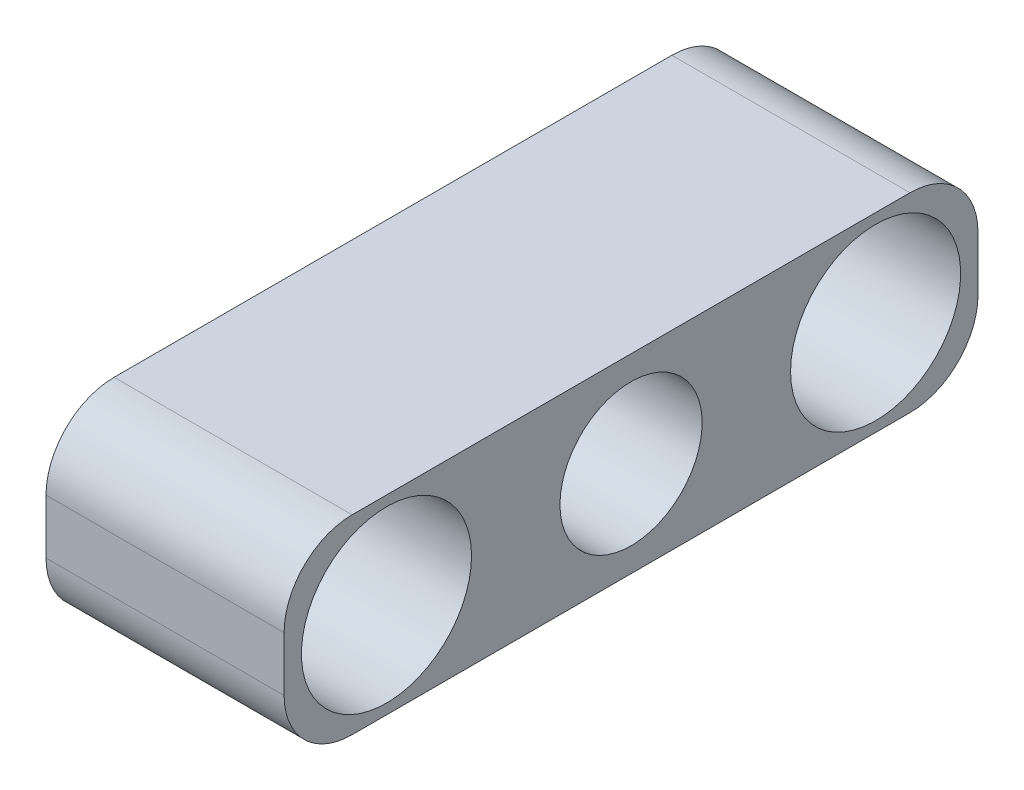
ISO-10303-21;
HEADER;
FILE_DESCRIPTION(('STEP AP214'),'2;1');
FILE_NAME('part.step','',(''),(''),'','','');
FILE_SCHEMA(('AUTOMOTIVE_DESIGN { 1 0 10303 214 1 1 1 1 }'));
ENDSEC;
DATA;
#1=APPLICATION_CONTEXT('core data for automotive mechanical design processes');
#2=APPLICATION_PROTOCOL_DEFINITION('international standard','automotive_design',2000,#1);
#3=PRODUCT_CONTEXT('',#1,'mechanical');
#4=PRODUCT('Part','Part','',(#3));
#5=PRODUCT_RELATED_PRODUCT_CATEGORY('part','',(#4));
#6=PRODUCT_DEFINITION_FORMATION('','',#4);
#7=PRODUCT_DEFINITION_CONTEXT('part definition',#1,'design');
#8=PRODUCT_DEFINITION('design','',#6,#7);
#9=PRODUCT_DEFINITION_SHAPE('','',#8);
#10=(LENGTH_UNIT() NAMED_UNIT(*) SI_UNIT(.MILLI.,.METRE.));
#11=(NAMED_UNIT(*) PLANE_ANGLE_UNIT() SI_UNIT($,.RADIAN.));
#12=(NAMED_UNIT(*) SI_UNIT($,.STERADIAN.) SOLID_ANGLE_UNIT());
#13=UNCERTAINTY_MEASURE_WITH_UNIT(LENGTH_MEASURE(1.E-05),#10,'distance_accuracy_value','');
#14=(GEOMETRIC_REPRESENTATION_CONTEXT(3) GLOBAL_UNCERTAINTY_ASSIGNED_CONTEXT((#13)) GLOBAL_UNIT_ASSIGNED_CONTEXT((#10,
#11,#12)) REPRESENTATION_CONTEXT('',''));
#15=CARTESIAN_POINT('',(0.,0.,0.));
#16=DIRECTION('',(0.,0.,1.));
#17=DIRECTION('',(1.,0.,0.));
#18=AXIS2_PLACEMENT_3D('',#15,#16,#17);
#19=CARTESIAN_POINT('',(-17.,-4.0000000000191,-41.0000000000019));
#20=DIRECTION('',(1.,0.,0.));
#21=DIRECTION('',(0.,0.,-1.));
#22=AXIS2_PLACEMENT_3D('',#19,#20,#21);
#23=CYLINDRICAL_SURFACE('',#22,10.);
#24=DIRECTION('',(-1.,0.,0.));
#25=VECTOR('',#24,1.);
#26=CARTESIAN_POINT('',(-17.,-4.0000000000191,-51.0000000000019));
#27=LINE('',#26,#25);
#28=CARTESIAN_POINT('',(18.,-4.0000000000191,-51.0000000000019));
#29=VERTEX_POINT('',#28);
#30=CARTESIAN_POINT('',(-17.,-4.0000000000191,-51.0000000000019));
#31=VERTEX_POINT('',#30);
#32=EDGE_CURVE('E159',#29,#31,#27,.T.);
#33=ORIENTED_EDGE('',*,*,#32,.F.);
#34=CARTESIAN_POINT('',(18.,-4.0000000000191,-41.0000000000019));
#35=DIRECTION('',(-1.,0.,0.));
#36=DIRECTION('',(0.,0.,1.));
#37=AXIS2_PLACEMENT_3D('',#34,#35,#36);
#38=CIRCLE('',#37,10.);
#39=CARTESIAN_POINT('',(18.,-14.00000000001,-40.9999999999968));
#40=VERTEX_POINT('',#39);
#41=EDGE_CURVE('E46',#40,#29,#38,.F.);
#42=ORIENTED_EDGE('',*,*,#41,.F.);
#43=DIRECTION('',(-1.,0.,0.));
#44=VECTOR('',#43,1.);
#45=CARTESIAN_POINT('',(-17.,-14.00000000001,-41.0000000000019));
#46=LINE('',#45,#44);
#47=CARTESIAN_POINT('',(-17.,-14.00000000001,-40.9999999999968));
#48=VERTEX_POINT('',#47);
#49=EDGE_CURVE('E161',#48,#40,#46,.F.);
#50=ORIENTED_EDGE('',*,*,#49,.F.);
#51=CARTESIAN_POINT('',(-17.,-4.0000000000191,-41.0000000000019));
#52=DIRECTION('',(-1.,0.,0.));
#53=DIRECTION('',(0.,0.,1.));
#54=AXIS2_PLACEMENT_3D('',#51,#52,#53);
#55=CIRCLE('',#54,10.);
#56=EDGE_CURVE('E11',#31,#48,#55,.T.);
#57=ORIENTED_EDGE('',*,*,#56,.F.);
#58=EDGE_LOOP('',(#33,#42,#50,#57));
#59=FACE_BOUND('',#58,.T.);
#60=ADVANCED_FACE('F39',(#59),#23,.T.);
#61=CARTESIAN_POINT('',(-17.,4.0000000000191,-41.0000000000019));
#62=DIRECTION('',(-1.,0.,0.));
#63=DIRECTION('',(0.,0.,1.));
#64=AXIS2_PLACEMENT_3D('',#61,#62,#63);
#65=CYLINDRICAL_SURFACE('',#64,10.);
#66=DIRECTION('',(1.,0.,0.));
#67=VECTOR('',#66,1.);
#68=CARTESIAN_POINT('',(-17.,4.0000000000191,-51.0000000000019));
#69=LINE('',#68,#67);
#70=CARTESIAN_POINT('',(-17.,4.0000000000191,-51.0000000000019));
#71=VERTEX_POINT('',#70);
#72=CARTESIAN_POINT('',(18.,4.0000000000191,-51.0000000000019));
#73=VERTEX_POINT('',#72);
#74=EDGE_CURVE('E148',#71,#73,#69,.T.);
#75=ORIENTED_EDGE('',*,*,#74,.F.);
#76=CARTESIAN_POINT('',(-17.,4.0000000000191,-41.0000000000019));
#77=DIRECTION('',(-1.,0.,0.));
#78=DIRECTION('',(0.,0.,1.));
#79=AXIS2_PLACEMENT_3D('',#76,#77,#78);
#80=CIRCLE('',#79,10.);
#81=CARTESIAN_POINT('',(-17.,14.00000000001,-40.9999999999968));
#82=VERTEX_POINT('',#81);
#83=EDGE_CURVE('E156',#82,#71,#80,.T.);
#84=ORIENTED_EDGE('',*,*,#83,.F.);
#85=DIRECTION('',(1.,0.,0.));
#86=VECTOR('',#85,1.);
#87=CARTESIAN_POINT('',(-17.,14.00000000001,-41.0000000000019));
#88=LINE('',#87,#86);
#89=CARTESIAN_POINT('',(18.,14.00000000001,-40.9999999999968));
#90=VERTEX_POINT('',#89);
#91=EDGE_CURVE('E151',#90,#82,#88,.F.);
#92=ORIENTED_EDGE('',*,*,#91,.F.);
#93=CARTESIAN_POINT('',(18.,4.0000000000191,-41.0000000000019));
#94=DIRECTION('',(-1.,0.,0.));
#95=DIRECTION('',(0.,0.,1.));
#96=AXIS2_PLACEMENT_3D('',#93,#94,#95);
#97=CIRCLE('',#96,10.);
#98=EDGE_CURVE('E158',#73,#90,#97,.F.);
#99=ORIENTED_EDGE('',*,*,#98,.F.);
#100=EDGE_LOOP('',(#75,#84,#92,#99));
#101=FACE_BOUND('',#100,.T.);
#102=ADVANCED_FACE('F207',(#101),#65,.T.);
#103=CARTESIAN_POINT('',(-17.,-4.0000000000191,41.0000000000019));
#104=DIRECTION('',(1.,0.,0.));
#105=DIRECTION('',(0.,0.,-1.));
#106=AXIS2_PLACEMENT_3D('',#103,#104,#105);
#107=CYLINDRICAL_SURFACE('',#106,10.);
#108=DIRECTION('',(1.,0.,0.));
#109=VECTOR('',#108,1.);
#110=CARTESIAN_POINT('',(-17.,-4.0000000000191,51.0000000000019));
#111=LINE('',#110,#109);
#112=CARTESIAN_POINT('',(-17.,-4.0000000000191,51.0000000000019));
#113=VERTEX_POINT('',#112);
#114=CARTESIAN_POINT('',(18.,-4.0000000000191,51.0000000000019));
#115=VERTEX_POINT('',#114);
#116=EDGE_CURVE('E130',#113,#115,#111,.T.);
#117=ORIENTED_EDGE('',*,*,#116,.F.);
#118=CARTESIAN_POINT('',(-17.,-4.0000000000191,41.0000000000019));
#119=DIRECTION('',(-1.,0.,0.));
#120=DIRECTION('',(0.,0.,1.));
#121=AXIS2_PLACEMENT_3D('',#118,#119,#120);
#122=CIRCLE('',#121,10.);
#123=CARTESIAN_POINT('',(-17.,-14.00000000001,40.9999999999968));
#124=VERTEX_POINT('',#123);
#125=EDGE_CURVE('E147',#124,#113,#122,.T.);
#126=ORIENTED_EDGE('',*,*,#125,.F.);
#127=DIRECTION('',(1.,0.,0.));
#128=VECTOR('',#127,1.);
#129=CARTESIAN_POINT('',(-17.,-14.00000000001,40.9999999999968));
#130=LINE('',#129,#128);
#131=CARTESIAN_POINT('',(18.,-14.00000000001,40.9999999999968));
#132=VERTEX_POINT('',#131);
#133=EDGE_CURVE('E141',#132,#124,#130,.F.);
#134=ORIENTED_EDGE('',*,*,#133,.F.);
#135=CARTESIAN_POINT('',(18.,-4.0000000000191,41.0000000000019));
#136=DIRECTION('',(-1.,0.,0.));
#137=DIRECTION('',(0.,0.,1.));
#138=AXIS2_PLACEMENT_3D('',#135,#136,#137);
#139=CIRCLE('',#138,10.);
#140=EDGE_CURVE('E150',#115,#132,#139,.F.);
#141=ORIENTED_EDGE('',*,*,#140,.F.);
#142=EDGE_LOOP('',(#117,#126,#134,#141));
#143=FACE_BOUND('',#142,.T.);
#144=ADVANCED_FACE('F212',(#143),#107,.T.);
#145=CARTESIAN_POINT('',(-17.,4.0000000000191,41.0000000000019));
#146=DIRECTION('',(-1.,0.,0.));
#147=DIRECTION('',(0.,0.,1.));
#148=AXIS2_PLACEMENT_3D('',#145,#146,#147);
#149=CYLINDRICAL_SURFACE('',#148,10.);
#150=DIRECTION('',(-1.,0.,0.));
#151=VECTOR('',#150,1.);
#152=CARTESIAN_POINT('',(-17.,4.0000000000191,51.0000000000019));
#153=LINE('',#152,#151);
#154=CARTESIAN_POINT('',(18.,4.0000000000191,51.0000000000019));
#155=VERTEX_POINT('',#154);
#156=CARTESIAN_POINT('',(-17.,4.0000000000191,51.0000000000019));
#157=VERTEX_POINT('',#156);
#158=EDGE_CURVE('E120',#155,#157,#153,.T.);
#159=ORIENTED_EDGE('',*,*,#158,.F.);
#160=CARTESIAN_POINT('',(18.,4.0000000000191,41.0000000000019));
#161=DIRECTION('',(-1.,0.,0.));
#162=DIRECTION('',(0.,0.,1.));
#163=AXIS2_PLACEMENT_3D('',#160,#161,#162);
#164=CIRCLE('',#163,10.);
#165=CARTESIAN_POINT('',(18.,14.00000000001,40.9999999999968));
#166=VERTEX_POINT('',#165);
#167=EDGE_CURVE('E103',#166,#155,#164,.F.);
#168=ORIENTED_EDGE('',*,*,#167,.F.);
#169=DIRECTION('',(-1.,0.,0.));
#170=VECTOR('',#169,1.);
#171=CARTESIAN_POINT('',(-17.,14.00000000001,40.9999999999968));
#172=LINE('',#171,#170);
#173=CARTESIAN_POINT('',(-17.,14.00000000001,40.9999999999968));
#174=VERTEX_POINT('',#173);
#175=EDGE_CURVE('E112',#174,#166,#172,.F.);
#176=ORIENTED_EDGE('',*,*,#175,.F.);
#177=CARTESIAN_POINT('',(-17.,4.0000000000191,41.0000000000019));
#178=DIRECTION('',(-1.,0.,0.));
#179=DIRECTION('',(0.,0.,1.));
#180=AXIS2_PLACEMENT_3D('',#177,#178,#179);
#181=CIRCLE('',#180,10.);
#182=EDGE_CURVE('E113',#157,#174,#181,.T.);
#183=ORIENTED_EDGE('',*,*,#182,.F.);
#184=EDGE_LOOP('',(#159,#168,#176,#183));
#185=FACE_BOUND('',#184,.T.);
#186=ADVANCED_FACE('F117',(#185),#149,.T.);
#187=CARTESIAN_POINT('',(-17.,-14.00000000001,116758.401593134));
#188=DIRECTION('',(0.,-1.,0.));
#189=DIRECTION('',(0.,0.,-1.));
#190=AXIS2_PLACEMENT_3D('',#187,#188,#189);
#191=PLANE('',#190);
#192=DIRECTION('',(0.,0.,-1.));
#193=VECTOR('',#192,1.);
#194=CARTESIAN_POINT('',(-17.,-14.00000000001,116758.401593134));
#195=LINE('',#194,#193);
#196=EDGE_CURVE('E126',#124,#48,#195,.T.);
#197=ORIENTED_EDGE('',*,*,#196,.T.);
#198=ORIENTED_EDGE('',*,*,#49,.T.);
#199=DIRECTION('',(0.,0.,-1.));
#200=VECTOR('',#199,1.);
#201=CARTESIAN_POINT('',(18.,-14.00000000001,116758.401593134));
#202=LINE('',#201,#200);
#203=EDGE_CURVE('E132',#132,#40,#202,.T.);
#204=ORIENTED_EDGE('',*,*,#203,.F.);
#205=ORIENTED_EDGE('',*,*,#133,.T.);
#206=EDGE_LOOP('',(#197,#198,#204,#205));
#207=FACE_BOUND('',#206,.T.);
#208=ADVANCED_FACE('F225',(#207),#191,.T.);
#209=CARTESIAN_POINT('',(-17.,-481034.717744328,51.0000000000019));
#210=DIRECTION('',(0.,0.,1.));
#211=DIRECTION('',(1.,0.,0.));
#212=AXIS2_PLACEMENT_3D('',#209,#210,#211);
#213=PLANE('',#212);
#214=DIRECTION('',(0.,-1.,0.));
#215=VECTOR('',#214,1.);
#216=CARTESIAN_POINT('',(-17.,-481034.717744328,51.0000000000019));
#217=LINE('',#216,#215);
#218=EDGE_CURVE('E124',#157,#113,#217,.T.);
#219=ORIENTED_EDGE('',*,*,#218,.T.);
#220=ORIENTED_EDGE('',*,*,#116,.T.);
#221=DIRECTION('',(0.,-1.,0.));
#222=VECTOR('',#221,1.);
#223=CARTESIAN_POINT('',(18.,-481034.717744328,51.0000000000019));
#224=LINE('',#223,#222);
#225=EDGE_CURVE('E110',#155,#115,#224,.T.);
#226=ORIENTED_EDGE('',*,*,#225,.F.);
#227=ORIENTED_EDGE('',*,*,#158,.T.);
#228=EDGE_LOOP('',(#219,#220,#226,#227));
#229=FACE_BOUND('',#228,.T.);
#230=ADVANCED_FACE('F127',(#229),#213,.T.);
#231=CARTESIAN_POINT('',(-17.,14.00000000001,116758.401593134));
#232=DIRECTION('',(0.,1.,0.));
#233=DIRECTION('',(0.,0.,1.));
#234=AXIS2_PLACEMENT_3D('',#231,#232,#233);
#235=PLANE('',#234);
#236=DIRECTION('',(0.,0.,1.));
#237=VECTOR('',#236,1.);
#238=CARTESIAN_POINT('',(18.,14.00000000001,116758.401593134));
#239=LINE('',#238,#237);
#240=EDGE_CURVE('E107',#90,#166,#239,.T.);
#241=ORIENTED_EDGE('',*,*,#240,.F.);
#242=ORIENTED_EDGE('',*,*,#91,.T.);
#243=DIRECTION('',(0.,0.,1.));
#244=VECTOR('',#243,1.);
#245=CARTESIAN_POINT('',(-17.,14.00000000001,116758.401593134));
#246=LINE('',#245,#244);
#247=EDGE_CURVE('E135',#82,#174,#246,.T.);
#248=ORIENTED_EDGE('',*,*,#247,.T.);
#249=ORIENTED_EDGE('',*,*,#175,.T.);
#250=EDGE_LOOP('',(#241,#242,#248,#249));
#251=FACE_BOUND('',#250,.T.);
#252=ADVANCED_FACE('F199',(#251),#235,.T.);
#253=CARTESIAN_POINT('',(-17.,0.,0.));
#254=DIRECTION('',(-1.,0.,0.));
#255=DIRECTION('',(0.,0.,1.));
#256=AXIS2_PLACEMENT_3D('',#253,#254,#255);
#257=PLANE('',#256);
#258=CARTESIAN_POINT('',(-17.,0.,-35.95));
#259=DIRECTION('',(-1.,0.,0.));
#260=DIRECTION('',(0.,0.,1.));
#261=AXIS2_PLACEMENT_3D('',#258,#259,#260);
#262=CIRCLE('',#261,12.5);
#263=CARTESIAN_POINT('',(-17.,0.,-23.45));
#264=VERTEX_POINT('',#263);
#265=EDGE_CURVE('E344',#264,#264,#262,.T.);
#266=ORIENTED_EDGE('',*,*,#265,.F.);
#267=EDGE_LOOP('',(#266));
#268=FACE_BOUND('',#267,.T.);
#269=CARTESIAN_POINT('',(-17.,0.,0.));
#270=DIRECTION('',(-1.,0.,0.));
#271=DIRECTION('',(0.,0.,1.));
#272=AXIS2_PLACEMENT_3D('',#269,#270,#271);
#273=CIRCLE('',#272,6.5);
#274=CARTESIAN_POINT('',(-17.,0.,6.5));
#275=VERTEX_POINT('',#274);
#276=EDGE_CURVE('E347',#275,#275,#273,.T.);
#277=ORIENTED_EDGE('',*,*,#276,.F.);
#278=EDGE_LOOP('',(#277));
#279=FACE_BOUND('',#278,.T.);
#280=DIRECTION('',(0.,-1.,0.));
#281=VECTOR('',#280,1.);
#282=CARTESIAN_POINT('',(-17.,-481034.717744328,-51.0000000000019));
#283=LINE('',#282,#281);
#284=EDGE_CURVE('E175',#71,#31,#283,.T.);
#285=ORIENTED_EDGE('',*,*,#284,.T.);
#286=ORIENTED_EDGE('',*,*,#56,.T.);
#287=ORIENTED_EDGE('',*,*,#196,.F.);
#288=ORIENTED_EDGE('',*,*,#125,.T.);
#289=ORIENTED_EDGE('',*,*,#218,.F.);
#290=ORIENTED_EDGE('',*,*,#182,.T.);
#291=ORIENTED_EDGE('',*,*,#247,.F.);
#292=ORIENTED_EDGE('',*,*,#83,.T.);
#293=EDGE_LOOP('',(#285,#286,#287,#288,#289,#290,#291,#292));
#294=FACE_BOUND('',#293,.T.);
#295=CARTESIAN_POINT('',(-17.,0.,35.95));
#296=DIRECTION('',(1.,0.,0.));
#297=DIRECTION('',(0.,0.,-1.));
#298=AXIS2_PLACEMENT_3D('',#295,#296,#297);
#299=CIRCLE('',#298,12.5);
#300=CARTESIAN_POINT('',(-17.,0.,23.45));
#301=VERTEX_POINT('',#300);
#302=EDGE_CURVE('E185',#301,#301,#299,.T.);
#303=ORIENTED_EDGE('',*,*,#302,.T.);
#304=EDGE_LOOP('',(#303));
#305=FACE_BOUND('',#304,.T.);
#306=ADVANCED_FACE('F188',(#268,#279,#294,#305),#257,.T.);
#307=CARTESIAN_POINT('',(18.,0.,0.));
#308=DIRECTION('',(-1.,0.,0.));
#309=DIRECTION('',(0.,0.,1.));
#310=AXIS2_PLACEMENT_3D('',#307,#308,#309);
#311=PLANE('',#310);
#312=CARTESIAN_POINT('',(18.,0.,-35.95));
#313=DIRECTION('',(-1.,0.,0.));
#314=DIRECTION('',(0.,0.,1.));
#315=AXIS2_PLACEMENT_3D('',#312,#313,#314);
#316=CIRCLE('',#315,12.5);
#317=CARTESIAN_POINT('',(18.,0.,-23.45));
#318=VERTEX_POINT('',#317);
#319=EDGE_CURVE('E341',#318,#318,#316,.T.);
#320=ORIENTED_EDGE('',*,*,#319,.T.);
#321=EDGE_LOOP('',(#320));
#322=FACE_BOUND('',#321,.T.);
#323=CARTESIAN_POINT('',(18.,0.,0.));
#324=DIRECTION('',(-1.,0.,0.));
#325=DIRECTION('',(0.,0.,1.));
#326=AXIS2_PLACEMENT_3D('',#323,#324,#325);
#327=CIRCLE('',#326,10.45);
#328=CARTESIAN_POINT('',(18.,0.,10.45));
#329=VERTEX_POINT('',#328);
#330=EDGE_CURVE('E178',#329,#329,#327,.T.);
#331=ORIENTED_EDGE('',*,*,#330,.T.);
#332=EDGE_LOOP('',(#331));
#333=FACE_BOUND('',#332,.T.);
#334=ORIENTED_EDGE('',*,*,#203,.T.);
#335=ORIENTED_EDGE('',*,*,#41,.T.);
#336=DIRECTION('',(0.,-1.,0.));
#337=VECTOR('',#336,1.);
#338=CARTESIAN_POINT('',(18.,-481034.717744328,-51.0000000000019));
#339=LINE('',#338,#337);
#340=EDGE_CURVE('E168',#73,#29,#339,.T.);
#341=ORIENTED_EDGE('',*,*,#340,.F.);
#342=ORIENTED_EDGE('',*,*,#98,.T.);
#343=ORIENTED_EDGE('',*,*,#240,.T.);
#344=ORIENTED_EDGE('',*,*,#167,.T.);
#345=ORIENTED_EDGE('',*,*,#225,.T.);
#346=ORIENTED_EDGE('',*,*,#140,.T.);
#347=EDGE_LOOP('',(#334,#335,#341,#342,#343,#344,#345,#346));
#348=FACE_BOUND('',#347,.T.);
#349=CARTESIAN_POINT('',(18.,0.,35.95));
#350=DIRECTION('',(1.,0.,0.));
#351=DIRECTION('',(0.,0.,-1.));
#352=AXIS2_PLACEMENT_3D('',#349,#350,#351);
#353=CIRCLE('',#352,12.5);
#354=CARTESIAN_POINT('',(18.,0.,23.45));
#355=VERTEX_POINT('',#354);
#356=EDGE_CURVE('E174',#355,#355,#353,.T.);
#357=ORIENTED_EDGE('',*,*,#356,.F.);
#358=EDGE_LOOP('',(#357));
#359=FACE_BOUND('',#358,.T.);
#360=ADVANCED_FACE('F104',(#322,#333,#348,#359),#311,.F.);
#361=CARTESIAN_POINT('',(-17.,0.,35.95));
#362=DIRECTION('',(1.,0.,0.));
#363=DIRECTION('',(0.,0.,-1.));
#364=AXIS2_PLACEMENT_3D('',#361,#362,#363);
#365=CYLINDRICAL_SURFACE('',#364,12.5);
#366=ORIENTED_EDGE('',*,*,#302,.F.);
#367=EDGE_LOOP('',(#366));
#368=FACE_BOUND('',#367,.T.);
#369=ORIENTED_EDGE('',*,*,#356,.T.);
#370=EDGE_LOOP('',(#369));
#371=FACE_BOUND('',#370,.T.);
#372=ADVANCED_FACE('F189',(#368,#371),#365,.F.);
#373=CARTESIAN_POINT('',(-17.,-481034.717744328,-51.0000000000019));
#374=DIRECTION('',(0.,0.,1.));
#375=DIRECTION('',(1.,0.,0.));
#376=AXIS2_PLACEMENT_3D('',#373,#374,#375);
#377=PLANE('',#376);
#378=ORIENTED_EDGE('',*,*,#340,.T.);
#379=ORIENTED_EDGE('',*,*,#32,.T.);
#380=ORIENTED_EDGE('',*,*,#284,.F.);
#381=ORIENTED_EDGE('',*,*,#74,.T.);
#382=EDGE_LOOP('',(#378,#379,#380,#381));
#383=FACE_BOUND('',#382,.T.);
#384=ADVANCED_FACE('F167',(#383),#377,.F.);
#385=CARTESIAN_POINT('',(-14.,0.,0.));
#386=DIRECTION('',(1.,0.,0.));
#387=DIRECTION('',(0.,0.,-1.));
#388=AXIS2_PLACEMENT_3D('',#385,#386,#387);
#389=CYLINDRICAL_SURFACE('',#388,10.45);
#390=CARTESIAN_POINT('',(-14.,0.,0.));
#391=DIRECTION('',(-1.,0.,0.));
#392=DIRECTION('',(0.,0.,1.));
#393=AXIS2_PLACEMENT_3D('',#390,#391,#392);
#394=CIRCLE('',#393,10.45);
#395=CARTESIAN_POINT('',(-14.,0.,10.45));
#396=VERTEX_POINT('',#395);
#397=EDGE_CURVE('E173',#396,#396,#394,.T.);
#398=ORIENTED_EDGE('',*,*,#397,.T.);
#399=EDGE_LOOP('',(#398));
#400=FACE_BOUND('',#399,.T.);
#401=ORIENTED_EDGE('',*,*,#330,.F.);
#402=EDGE_LOOP('',(#401));
#403=FACE_BOUND('',#402,.T.);
#404=ADVANCED_FACE('F287',(#400,#403),#389,.F.);
#405=CARTESIAN_POINT('',(-14.,0.,0.));
#406=DIRECTION('',(1.,0.,0.));
#407=DIRECTION('',(0.,0.,1.));
#408=AXIS2_PLACEMENT_3D('',#405,#406,#407);
#409=PLANE('',#408);
#410=CARTESIAN_POINT('',(-14.,0.,0.));
#411=DIRECTION('',(-1.,0.,0.));
#412=DIRECTION('',(0.,0.,1.));
#413=AXIS2_PLACEMENT_3D('',#410,#411,#412);
#414=CIRCLE('',#413,6.5);
#415=CARTESIAN_POINT('',(-14.,0.,6.5));
#416=VERTEX_POINT('',#415);
#417=EDGE_CURVE('E348',#416,#416,#414,.T.);
#418=ORIENTED_EDGE('',*,*,#417,.T.);
#419=EDGE_LOOP('',(#418));
#420=FACE_BOUND('',#419,.T.);
#421=ORIENTED_EDGE('',*,*,#397,.F.);
#422=EDGE_LOOP('',(#421));
#423=FACE_BOUND('',#422,.T.);
#424=ADVANCED_FACE('F296',(#420,#423),#409,.T.);
#425=CARTESIAN_POINT('',(-17.,0.,0.));
#426=DIRECTION('',(1.,0.,0.));
#427=DIRECTION('',(0.,0.,-1.));
#428=AXIS2_PLACEMENT_3D('',#425,#426,#427);
#429=CYLINDRICAL_SURFACE('',#428,6.5);
#430=ORIENTED_EDGE('',*,*,#276,.T.);
#431=EDGE_LOOP('',(#430));
#432=FACE_BOUND('',#431,.T.);
#433=ORIENTED_EDGE('',*,*,#417,.F.);
#434=EDGE_LOOP('',(#433));
#435=FACE_BOUND('',#434,.T.);
#436=ADVANCED_FACE('F308',(#432,#435),#429,.F.);
#437=CARTESIAN_POINT('',(-17.,0.,-35.95));
#438=DIRECTION('',(1.,0.,0.));
#439=DIRECTION('',(0.,0.,-1.));
#440=AXIS2_PLACEMENT_3D('',#437,#438,#439);
#441=CYLINDRICAL_SURFACE('',#440,12.5);
#442=ORIENTED_EDGE('',*,*,#265,.T.);
#443=EDGE_LOOP('',(#442));
#444=FACE_BOUND('',#443,.T.);
#445=ORIENTED_EDGE('',*,*,#319,.F.);
#446=EDGE_LOOP('',(#445));
#447=FACE_BOUND('',#446,.T.);
#448=ADVANCED_FACE('F319',(#444,#447),#441,.F.);
#449=CLOSED_SHELL('',(#60,#102,#144,#186,#208,#230,#252,#306,#360,#372,#384,#404,#424,#436,#448));
#450=MANIFOLD_SOLID_BREP('B2',#449);
#451=ADVANCED_BREP_SHAPE_REPRESENTATION('',(#18,#450),#14);
#452=SHAPE_DEFINITION_REPRESENTATION(#9,#451);
ENDSEC;
END-ISO-10303-21;
